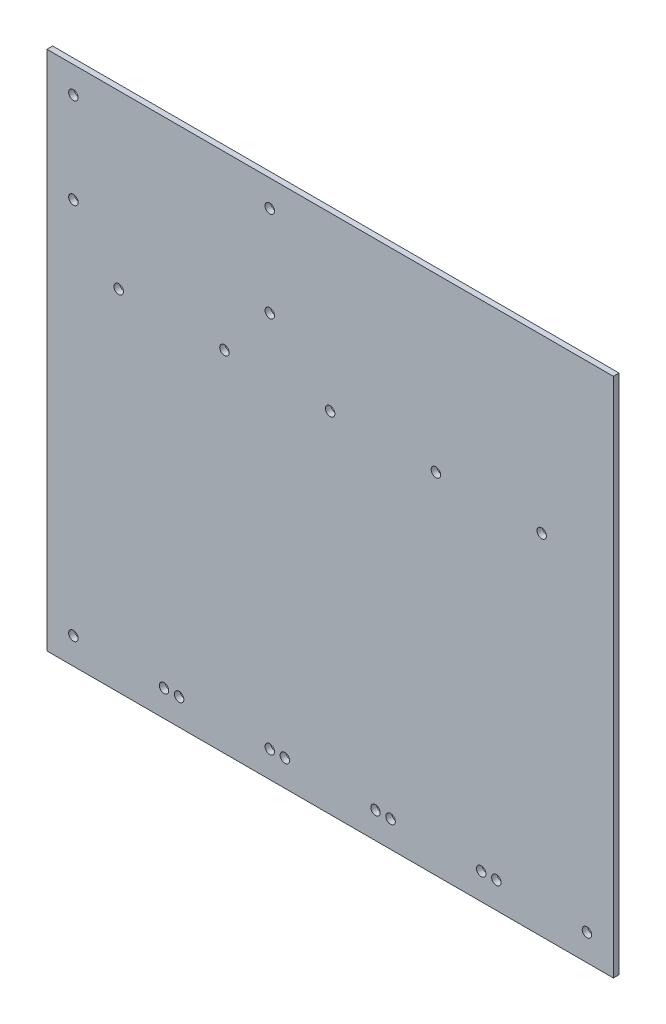
ISO-10303-21;
HEADER;
FILE_DESCRIPTION(('STEP AP214'),'2;1');
FILE_NAME('part.step','',(''),(''),'','','');
FILE_SCHEMA(('AUTOMOTIVE_DESIGN { 1 0 10303 214 1 1 1 1 }'));
ENDSEC;
DATA;
#1=APPLICATION_CONTEXT('core data for automotive mechanical design processes');
#2=APPLICATION_PROTOCOL_DEFINITION('international standard','automotive_design',2000,#1);
#3=PRODUCT_CONTEXT('',#1,'mechanical');
#4=PRODUCT('Part','Part','',(#3));
#5=PRODUCT_RELATED_PRODUCT_CATEGORY('part','',(#4));
#6=PRODUCT_DEFINITION_FORMATION('','',#4);
#7=PRODUCT_DEFINITION_CONTEXT('part definition',#1,'design');
#8=PRODUCT_DEFINITION('design','',#6,#7);
#9=PRODUCT_DEFINITION_SHAPE('','',#8);
#10=(LENGTH_UNIT() NAMED_UNIT(*) SI_UNIT(.MILLI.,.METRE.));
#11=(NAMED_UNIT(*) PLANE_ANGLE_UNIT() SI_UNIT($,.RADIAN.));
#12=(NAMED_UNIT(*) SI_UNIT($,.STERADIAN.) SOLID_ANGLE_UNIT());
#13=UNCERTAINTY_MEASURE_WITH_UNIT(LENGTH_MEASURE(1.E-05),#10,'distance_accuracy_value','');
#14=(GEOMETRIC_REPRESENTATION_CONTEXT(3) GLOBAL_UNCERTAINTY_ASSIGNED_CONTEXT((#13)) GLOBAL_UNIT_ASSIGNED_CONTEXT((#10,
#11,#12)) REPRESENTATION_CONTEXT('',''));
#15=CARTESIAN_POINT('',(0.,0.,0.));
#16=DIRECTION('',(0.,0.,1.));
#17=DIRECTION('',(1.,0.,0.));
#18=AXIS2_PLACEMENT_3D('',#15,#16,#17);
#19=CARTESIAN_POINT('',(0.,0.,3.));
#20=DIRECTION('',(0.,0.,1.));
#21=DIRECTION('',(1.,0.,0.));
#22=AXIS2_PLACEMENT_3D('',#19,#20,#21);
#23=PLANE('',#22);
#24=CARTESIAN_POINT('',(-28.,175.,3.));
#25=DIRECTION('',(0.,0.,1.));
#26=DIRECTION('',(1.,0.,0.));
#27=AXIS2_PLACEMENT_3D('',#24,#25,#26);
#28=CIRCLE('',#27,2.50000000000001);
#29=CARTESIAN_POINT('',(-25.5,175.,3.));
#30=VERTEX_POINT('',#29);
#31=EDGE_CURVE('E125',#30,#30,#28,.T.);
#32=ORIENTED_EDGE('',*,*,#31,.F.);
#33=EDGE_LOOP('',(#32));
#34=FACE_BOUND('',#33,.T.);
#35=CARTESIAN_POINT('',(84.,175.,3.));
#36=DIRECTION('',(0.,0.,1.));
#37=DIRECTION('',(1.,0.,0.));
#38=AXIS2_PLACEMENT_3D('',#35,#36,#37);
#39=CIRCLE('',#38,2.50000000000001);
#40=CARTESIAN_POINT('',(86.5,175.,3.));
#41=VERTEX_POINT('',#40);
#42=EDGE_CURVE('E137',#41,#41,#39,.T.);
#43=ORIENTED_EDGE('',*,*,#42,.F.);
#44=EDGE_LOOP('',(#43));
#45=FACE_BOUND('',#44,.T.);
#46=CARTESIAN_POINT('',(164.,4.,3.));
#47=DIRECTION('',(0.,0.,1.));
#48=DIRECTION('',(1.,0.,0.));
#49=AXIS2_PLACEMENT_3D('',#46,#47,#48);
#50=CIRCLE('',#49,2.5);
#51=CARTESIAN_POINT('',(166.5,4.,3.));
#52=VERTEX_POINT('',#51);
#53=EDGE_CURVE('E149',#52,#52,#50,.T.);
#54=ORIENTED_EDGE('',*,*,#53,.F.);
#55=EDGE_LOOP('',(#54));
#56=FACE_BOUND('',#55,.T.);
#57=CARTESIAN_POINT('',(108.,4.,3.));
#58=DIRECTION('',(0.,0.,1.));
#59=DIRECTION('',(1.,0.,0.));
#60=AXIS2_PLACEMENT_3D('',#57,#58,#59);
#61=CIRCLE('',#60,2.50000000000001);
#62=CARTESIAN_POINT('',(110.5,4.,3.));
#63=VERTEX_POINT('',#62);
#64=EDGE_CURVE('E161',#63,#63,#61,.T.);
#65=ORIENTED_EDGE('',*,*,#64,.F.);
#66=EDGE_LOOP('',(#65));
#67=FACE_BOUND('',#66,.T.);
#68=CARTESIAN_POINT('',(52.,3.99999999999997,3.));
#69=DIRECTION('',(0.,0.,1.));
#70=DIRECTION('',(1.,0.,0.));
#71=AXIS2_PLACEMENT_3D('',#68,#69,#70);
#72=CIRCLE('',#71,2.5);
#73=CARTESIAN_POINT('',(54.5,3.99999999999997,3.));
#74=VERTEX_POINT('',#73);
#75=EDGE_CURVE('E173',#74,#74,#72,.T.);
#76=ORIENTED_EDGE('',*,*,#75,.F.);
#77=EDGE_LOOP('',(#76));
#78=FACE_BOUND('',#77,.T.);
#79=CARTESIAN_POINT('',(-4.,4.,3.));
#80=DIRECTION('',(0.,0.,1.));
#81=DIRECTION('',(1.,0.,0.));
#82=AXIS2_PLACEMENT_3D('',#79,#80,#81);
#83=CIRCLE('',#82,2.5);
#84=CARTESIAN_POINT('',(-1.5,4.,3.));
#85=VERTEX_POINT('',#84);
#86=EDGE_CURVE('E185',#85,#85,#83,.T.);
#87=ORIENTED_EDGE('',*,*,#86,.F.);
#88=EDGE_LOOP('',(#87));
#89=FACE_BOUND('',#88,.T.);
#90=CARTESIAN_POINT('',(-60.,4.,3.));
#91=DIRECTION('',(0.,0.,1.));
#92=DIRECTION('',(1.,0.,0.));
#93=AXIS2_PLACEMENT_3D('',#90,#91,#92);
#94=CIRCLE('',#93,2.5);
#95=CARTESIAN_POINT('',(-57.5,4.,3.));
#96=VERTEX_POINT('',#95);
#97=EDGE_CURVE('E197',#96,#96,#94,.T.);
#98=ORIENTED_EDGE('',*,*,#97,.F.);
#99=EDGE_LOOP('',(#98));
#100=FACE_BOUND('',#99,.T.);
#101=DIRECTION('',(0.,-1.,0.));
#102=VECTOR('',#101,1.);
#103=CARTESIAN_POINT('',(178.,0.,3.));
#104=LINE('',#103,#102);
#105=CARTESIAN_POINT('',(178.,266.,3.));
#106=VERTEX_POINT('',#105);
#107=CARTESIAN_POINT('',(178.,-9.99999999999999,3.));
#108=VERTEX_POINT('',#107);
#109=EDGE_CURVE('E96',#106,#108,#104,.T.);
#110=ORIENTED_EDGE('',*,*,#109,.F.);
#111=DIRECTION('',(-1.,0.,0.));
#112=VECTOR('',#111,1.);
#113=CARTESIAN_POINT('',(178.,266.,3.));
#114=LINE('',#113,#112);
#115=CARTESIAN_POINT('',(-122.,266.,3.));
#116=VERTEX_POINT('',#115);
#117=EDGE_CURVE('E90',#106,#116,#114,.T.);
#118=ORIENTED_EDGE('',*,*,#117,.T.);
#119=DIRECTION('',(0.,-1.,0.));
#120=VECTOR('',#119,1.);
#121=CARTESIAN_POINT('',(-122.,0.,3.));
#122=LINE('',#121,#120);
#123=CARTESIAN_POINT('',(-122.,-9.99999999999999,3.));
#124=VERTEX_POINT('',#123);
#125=EDGE_CURVE('E64',#116,#124,#122,.T.);
#126=ORIENTED_EDGE('',*,*,#125,.T.);
#127=DIRECTION('',(1.,0.,0.));
#128=VECTOR('',#127,1.);
#129=CARTESIAN_POINT('',(-122.,-9.99999999999999,3.));
#130=LINE('',#129,#128);
#131=EDGE_CURVE('E92',#124,#108,#130,.T.);
#132=ORIENTED_EDGE('',*,*,#131,.T.);
#133=EDGE_LOOP('',(#110,#118,#126,#132));
#134=FACE_BOUND('',#133,.T.);
#135=CARTESIAN_POINT('',(-108.,4.,3.));
#136=DIRECTION('',(0.,0.,1.));
#137=DIRECTION('',(1.,0.,0.));
#138=AXIS2_PLACEMENT_3D('',#135,#136,#137);
#139=CIRCLE('',#138,2.50000000000001);
#140=CARTESIAN_POINT('',(-105.5,4.,3.));
#141=VERTEX_POINT('',#140);
#142=EDGE_CURVE('E11',#141,#141,#139,.T.);
#143=ORIENTED_EDGE('',*,*,#142,.F.);
#144=EDGE_LOOP('',(#143));
#145=FACE_BOUND('',#144,.T.);
#146=CARTESIAN_POINT('',(-52.,4.,3.));
#147=DIRECTION('',(0.,0.,1.));
#148=DIRECTION('',(1.,0.,0.));
#149=AXIS2_PLACEMENT_3D('',#146,#147,#148);
#150=CIRCLE('',#149,2.50000000000001);
#151=CARTESIAN_POINT('',(-49.5,4.,3.));
#152=VERTEX_POINT('',#151);
#153=EDGE_CURVE('E191',#152,#152,#150,.T.);
#154=ORIENTED_EDGE('',*,*,#153,.F.);
#155=EDGE_LOOP('',(#154));
#156=FACE_BOUND('',#155,.T.);
#157=CARTESIAN_POINT('',(4.,3.99999999999997,3.));
#158=DIRECTION('',(0.,0.,1.));
#159=DIRECTION('',(1.,0.,0.));
#160=AXIS2_PLACEMENT_3D('',#157,#158,#159);
#161=CIRCLE('',#160,2.50000000000001);
#162=CARTESIAN_POINT('',(6.50000000000001,3.99999999999997,3.));
#163=VERTEX_POINT('',#162);
#164=EDGE_CURVE('E179',#163,#163,#161,.T.);
#165=ORIENTED_EDGE('',*,*,#164,.F.);
#166=EDGE_LOOP('',(#165));
#167=FACE_BOUND('',#166,.T.);
#168=CARTESIAN_POINT('',(60.,4.,3.));
#169=DIRECTION('',(0.,0.,1.));
#170=DIRECTION('',(1.,0.,0.));
#171=AXIS2_PLACEMENT_3D('',#168,#169,#170);
#172=CIRCLE('',#171,2.50000000000002);
#173=CARTESIAN_POINT('',(62.5,4.,3.));
#174=VERTEX_POINT('',#173);
#175=EDGE_CURVE('E167',#174,#174,#172,.T.);
#176=ORIENTED_EDGE('',*,*,#175,.F.);
#177=EDGE_LOOP('',(#176));
#178=FACE_BOUND('',#177,.T.);
#179=CARTESIAN_POINT('',(116.,4.,3.));
#180=DIRECTION('',(0.,0.,1.));
#181=DIRECTION('',(1.,0.,0.));
#182=AXIS2_PLACEMENT_3D('',#179,#180,#181);
#183=CIRCLE('',#182,2.50000000000001);
#184=CARTESIAN_POINT('',(118.5,4.,3.));
#185=VERTEX_POINT('',#184);
#186=EDGE_CURVE('E155',#185,#185,#183,.T.);
#187=ORIENTED_EDGE('',*,*,#186,.F.);
#188=EDGE_LOOP('',(#187));
#189=FACE_BOUND('',#188,.T.);
#190=CARTESIAN_POINT('',(140.,175.,3.));
#191=DIRECTION('',(0.,0.,1.));
#192=DIRECTION('',(1.,0.,0.));
#193=AXIS2_PLACEMENT_3D('',#190,#191,#192);
#194=CIRCLE('',#193,2.5);
#195=CARTESIAN_POINT('',(142.5,175.,3.));
#196=VERTEX_POINT('',#195);
#197=EDGE_CURVE('E143',#196,#196,#194,.T.);
#198=ORIENTED_EDGE('',*,*,#197,.F.);
#199=EDGE_LOOP('',(#198));
#200=FACE_BOUND('',#199,.T.);
#201=CARTESIAN_POINT('',(28.,175.,3.));
#202=DIRECTION('',(0.,0.,1.));
#203=DIRECTION('',(1.,0.,0.));
#204=AXIS2_PLACEMENT_3D('',#201,#202,#203);
#205=CIRCLE('',#204,2.49999999999999);
#206=CARTESIAN_POINT('',(30.5,175.,3.));
#207=VERTEX_POINT('',#206);
#208=EDGE_CURVE('E131',#207,#207,#205,.T.);
#209=ORIENTED_EDGE('',*,*,#208,.F.);
#210=EDGE_LOOP('',(#209));
#211=FACE_BOUND('',#210,.T.);
#212=CARTESIAN_POINT('',(-84.,175.,3.));
#213=DIRECTION('',(0.,0.,1.));
#214=DIRECTION('',(1.,0.,0.));
#215=AXIS2_PLACEMENT_3D('',#212,#213,#214);
#216=CIRCLE('',#215,2.5);
#217=CARTESIAN_POINT('',(-81.5,175.,3.));
#218=VERTEX_POINT('',#217);
#219=EDGE_CURVE('E119',#218,#218,#216,.T.);
#220=ORIENTED_EDGE('',*,*,#219,.F.);
#221=EDGE_LOOP('',(#220));
#222=FACE_BOUND('',#221,.T.);
#223=CARTESIAN_POINT('',(-108.,204.,3.));
#224=DIRECTION('',(0.,0.,1.));
#225=DIRECTION('',(1.,0.,0.));
#226=AXIS2_PLACEMENT_3D('',#223,#224,#225);
#227=CIRCLE('',#226,2.5);
#228=CARTESIAN_POINT('',(-105.5,204.,3.));
#229=VERTEX_POINT('',#228);
#230=EDGE_CURVE('E299',#229,#229,#227,.T.);
#231=ORIENTED_EDGE('',*,*,#230,.F.);
#232=EDGE_LOOP('',(#231));
#233=FACE_BOUND('',#232,.T.);
#234=CARTESIAN_POINT('',(-108.,252.,3.));
#235=DIRECTION('',(0.,0.,1.));
#236=DIRECTION('',(1.,0.,0.));
#237=AXIS2_PLACEMENT_3D('',#234,#235,#236);
#238=CIRCLE('',#237,2.5);
#239=CARTESIAN_POINT('',(-105.5,252.,3.));
#240=VERTEX_POINT('',#239);
#241=EDGE_CURVE('E295',#240,#240,#238,.T.);
#242=ORIENTED_EDGE('',*,*,#241,.F.);
#243=EDGE_LOOP('',(#242));
#244=FACE_BOUND('',#243,.T.);
#245=CARTESIAN_POINT('',(-4.00000000000027,252.,3.));
#246=DIRECTION('',(0.,0.,1.));
#247=DIRECTION('',(1.,0.,0.));
#248=AXIS2_PLACEMENT_3D('',#245,#246,#247);
#249=CIRCLE('',#248,2.49999999999999);
#250=CARTESIAN_POINT('',(-1.50000000000028,252.,3.));
#251=VERTEX_POINT('',#250);
#252=EDGE_CURVE('E290',#251,#251,#249,.T.);
#253=ORIENTED_EDGE('',*,*,#252,.F.);
#254=EDGE_LOOP('',(#253));
#255=FACE_BOUND('',#254,.T.);
#256=CARTESIAN_POINT('',(-4.00000000000027,204.,3.));
#257=DIRECTION('',(0.,0.,1.));
#258=DIRECTION('',(1.,0.,0.));
#259=AXIS2_PLACEMENT_3D('',#256,#257,#258);
#260=CIRCLE('',#259,2.5);
#261=CARTESIAN_POINT('',(-1.50000000000027,204.,3.));
#262=VERTEX_POINT('',#261);
#263=EDGE_CURVE('E102',#262,#262,#260,.T.);
#264=ORIENTED_EDGE('',*,*,#263,.F.);
#265=EDGE_LOOP('',(#264));
#266=FACE_BOUND('',#265,.T.);
#267=ADVANCED_FACE('F35',(#34,#45,#56,#67,#78,#89,#100,#134,#145,#156,#167,#178,#189,#200,#211,
#222,#233,#244,#255,#266),#23,.T.);
#268=CARTESIAN_POINT('',(0.,0.,0.));
#269=DIRECTION('',(0.,0.,1.));
#270=DIRECTION('',(1.,0.,0.));
#271=AXIS2_PLACEMENT_3D('',#268,#269,#270);
#272=PLANE('',#271);
#273=DIRECTION('',(0.,-1.,0.));
#274=VECTOR('',#273,1.);
#275=CARTESIAN_POINT('',(178.,0.,0.));
#276=LINE('',#275,#274);
#277=CARTESIAN_POINT('',(178.,266.,0.));
#278=VERTEX_POINT('',#277);
#279=CARTESIAN_POINT('',(178.,-9.99999999999999,0.));
#280=VERTEX_POINT('',#279);
#281=EDGE_CURVE('E52',#278,#280,#276,.T.);
#282=ORIENTED_EDGE('',*,*,#281,.T.);
#283=DIRECTION('',(1.,0.,0.));
#284=VECTOR('',#283,1.);
#285=CARTESIAN_POINT('',(-122.,-9.99999999999999,0.));
#286=LINE('',#285,#284);
#287=CARTESIAN_POINT('',(-122.,-9.99999999999999,0.));
#288=VERTEX_POINT('',#287);
#289=EDGE_CURVE('E107',#288,#280,#286,.T.);
#290=ORIENTED_EDGE('',*,*,#289,.F.);
#291=DIRECTION('',(0.,-1.,0.));
#292=VECTOR('',#291,1.);
#293=CARTESIAN_POINT('',(-122.,0.,0.));
#294=LINE('',#293,#292);
#295=CARTESIAN_POINT('',(-122.,266.,0.));
#296=VERTEX_POINT('',#295);
#297=EDGE_CURVE('E70',#296,#288,#294,.T.);
#298=ORIENTED_EDGE('',*,*,#297,.F.);
#299=DIRECTION('',(-1.,0.,0.));
#300=VECTOR('',#299,1.);
#301=CARTESIAN_POINT('',(178.,266.,0.));
#302=LINE('',#301,#300);
#303=EDGE_CURVE('E91',#278,#296,#302,.T.);
#304=ORIENTED_EDGE('',*,*,#303,.F.);
#305=EDGE_LOOP('',(#282,#290,#298,#304));
#306=FACE_BOUND('',#305,.T.);
#307=CARTESIAN_POINT('',(-108.,4.,0.));
#308=DIRECTION('',(0.,0.,1.));
#309=DIRECTION('',(1.,0.,0.));
#310=AXIS2_PLACEMENT_3D('',#307,#308,#309);
#311=CIRCLE('',#310,2.50000000000001);
#312=CARTESIAN_POINT('',(-105.5,4.,0.));
#313=VERTEX_POINT('',#312);
#314=EDGE_CURVE('E39',#313,#313,#311,.T.);
#315=ORIENTED_EDGE('',*,*,#314,.T.);
#316=EDGE_LOOP('',(#315));
#317=FACE_BOUND('',#316,.T.);
#318=CARTESIAN_POINT('',(-60.,4.,0.));
#319=DIRECTION('',(0.,0.,1.));
#320=DIRECTION('',(1.,0.,0.));
#321=AXIS2_PLACEMENT_3D('',#318,#319,#320);
#322=CIRCLE('',#321,2.5);
#323=CARTESIAN_POINT('',(-57.5,4.,0.));
#324=VERTEX_POINT('',#323);
#325=EDGE_CURVE('E194',#324,#324,#322,.T.);
#326=ORIENTED_EDGE('',*,*,#325,.T.);
#327=EDGE_LOOP('',(#326));
#328=FACE_BOUND('',#327,.T.);
#329=CARTESIAN_POINT('',(-52.,4.,0.));
#330=DIRECTION('',(0.,0.,1.));
#331=DIRECTION('',(1.,0.,0.));
#332=AXIS2_PLACEMENT_3D('',#329,#330,#331);
#333=CIRCLE('',#332,2.50000000000001);
#334=CARTESIAN_POINT('',(-49.5,4.,0.));
#335=VERTEX_POINT('',#334);
#336=EDGE_CURVE('E188',#335,#335,#333,.T.);
#337=ORIENTED_EDGE('',*,*,#336,.T.);
#338=EDGE_LOOP('',(#337));
#339=FACE_BOUND('',#338,.T.);
#340=CARTESIAN_POINT('',(-4.,4.,0.));
#341=DIRECTION('',(0.,0.,1.));
#342=DIRECTION('',(1.,0.,0.));
#343=AXIS2_PLACEMENT_3D('',#340,#341,#342);
#344=CIRCLE('',#343,2.5);
#345=CARTESIAN_POINT('',(-1.5,4.,0.));
#346=VERTEX_POINT('',#345);
#347=EDGE_CURVE('E182',#346,#346,#344,.T.);
#348=ORIENTED_EDGE('',*,*,#347,.T.);
#349=EDGE_LOOP('',(#348));
#350=FACE_BOUND('',#349,.T.);
#351=CARTESIAN_POINT('',(4.,3.99999999999997,0.));
#352=DIRECTION('',(0.,0.,1.));
#353=DIRECTION('',(1.,0.,0.));
#354=AXIS2_PLACEMENT_3D('',#351,#352,#353);
#355=CIRCLE('',#354,2.50000000000001);
#356=CARTESIAN_POINT('',(6.50000000000001,3.99999999999997,0.));
#357=VERTEX_POINT('',#356);
#358=EDGE_CURVE('E176',#357,#357,#355,.T.);
#359=ORIENTED_EDGE('',*,*,#358,.T.);
#360=EDGE_LOOP('',(#359));
#361=FACE_BOUND('',#360,.T.);
#362=CARTESIAN_POINT('',(52.,3.99999999999997,0.));
#363=DIRECTION('',(0.,0.,1.));
#364=DIRECTION('',(1.,0.,0.));
#365=AXIS2_PLACEMENT_3D('',#362,#363,#364);
#366=CIRCLE('',#365,2.5);
#367=CARTESIAN_POINT('',(54.5,3.99999999999997,0.));
#368=VERTEX_POINT('',#367);
#369=EDGE_CURVE('E170',#368,#368,#366,.T.);
#370=ORIENTED_EDGE('',*,*,#369,.T.);
#371=EDGE_LOOP('',(#370));
#372=FACE_BOUND('',#371,.T.);
#373=CARTESIAN_POINT('',(60.,4.,0.));
#374=DIRECTION('',(0.,0.,1.));
#375=DIRECTION('',(1.,0.,0.));
#376=AXIS2_PLACEMENT_3D('',#373,#374,#375);
#377=CIRCLE('',#376,2.50000000000002);
#378=CARTESIAN_POINT('',(62.5,4.,0.));
#379=VERTEX_POINT('',#378);
#380=EDGE_CURVE('E164',#379,#379,#377,.T.);
#381=ORIENTED_EDGE('',*,*,#380,.T.);
#382=EDGE_LOOP('',(#381));
#383=FACE_BOUND('',#382,.T.);
#384=CARTESIAN_POINT('',(108.,4.,0.));
#385=DIRECTION('',(0.,0.,1.));
#386=DIRECTION('',(1.,0.,0.));
#387=AXIS2_PLACEMENT_3D('',#384,#385,#386);
#388=CIRCLE('',#387,2.50000000000001);
#389=CARTESIAN_POINT('',(110.5,4.,0.));
#390=VERTEX_POINT('',#389);
#391=EDGE_CURVE('E158',#390,#390,#388,.T.);
#392=ORIENTED_EDGE('',*,*,#391,.T.);
#393=EDGE_LOOP('',(#392));
#394=FACE_BOUND('',#393,.T.);
#395=CARTESIAN_POINT('',(116.,4.,0.));
#396=DIRECTION('',(0.,0.,1.));
#397=DIRECTION('',(1.,0.,0.));
#398=AXIS2_PLACEMENT_3D('',#395,#396,#397);
#399=CIRCLE('',#398,2.50000000000001);
#400=CARTESIAN_POINT('',(118.5,4.,0.));
#401=VERTEX_POINT('',#400);
#402=EDGE_CURVE('E152',#401,#401,#399,.T.);
#403=ORIENTED_EDGE('',*,*,#402,.T.);
#404=EDGE_LOOP('',(#403));
#405=FACE_BOUND('',#404,.T.);
#406=CARTESIAN_POINT('',(164.,4.,0.));
#407=DIRECTION('',(0.,0.,1.));
#408=DIRECTION('',(1.,0.,0.));
#409=AXIS2_PLACEMENT_3D('',#406,#407,#408);
#410=CIRCLE('',#409,2.5);
#411=CARTESIAN_POINT('',(166.5,4.,0.));
#412=VERTEX_POINT('',#411);
#413=EDGE_CURVE('E146',#412,#412,#410,.T.);
#414=ORIENTED_EDGE('',*,*,#413,.T.);
#415=EDGE_LOOP('',(#414));
#416=FACE_BOUND('',#415,.T.);
#417=CARTESIAN_POINT('',(140.,175.,0.));
#418=DIRECTION('',(0.,0.,1.));
#419=DIRECTION('',(1.,0.,0.));
#420=AXIS2_PLACEMENT_3D('',#417,#418,#419);
#421=CIRCLE('',#420,2.5);
#422=CARTESIAN_POINT('',(142.5,175.,0.));
#423=VERTEX_POINT('',#422);
#424=EDGE_CURVE('E140',#423,#423,#421,.T.);
#425=ORIENTED_EDGE('',*,*,#424,.T.);
#426=EDGE_LOOP('',(#425));
#427=FACE_BOUND('',#426,.T.);
#428=CARTESIAN_POINT('',(84.,175.,0.));
#429=DIRECTION('',(0.,0.,1.));
#430=DIRECTION('',(1.,0.,0.));
#431=AXIS2_PLACEMENT_3D('',#428,#429,#430);
#432=CIRCLE('',#431,2.50000000000001);
#433=CARTESIAN_POINT('',(86.5,175.,0.));
#434=VERTEX_POINT('',#433);
#435=EDGE_CURVE('E134',#434,#434,#432,.T.);
#436=ORIENTED_EDGE('',*,*,#435,.T.);
#437=EDGE_LOOP('',(#436));
#438=FACE_BOUND('',#437,.T.);
#439=CARTESIAN_POINT('',(28.,175.,0.));
#440=DIRECTION('',(0.,0.,1.));
#441=DIRECTION('',(1.,0.,0.));
#442=AXIS2_PLACEMENT_3D('',#439,#440,#441);
#443=CIRCLE('',#442,2.49999999999999);
#444=CARTESIAN_POINT('',(30.5,175.,0.));
#445=VERTEX_POINT('',#444);
#446=EDGE_CURVE('E128',#445,#445,#443,.T.);
#447=ORIENTED_EDGE('',*,*,#446,.T.);
#448=EDGE_LOOP('',(#447));
#449=FACE_BOUND('',#448,.T.);
#450=CARTESIAN_POINT('',(-28.,175.,0.));
#451=DIRECTION('',(0.,0.,1.));
#452=DIRECTION('',(1.,0.,0.));
#453=AXIS2_PLACEMENT_3D('',#450,#451,#452);
#454=CIRCLE('',#453,2.50000000000001);
#455=CARTESIAN_POINT('',(-25.5,175.,0.));
#456=VERTEX_POINT('',#455);
#457=EDGE_CURVE('E122',#456,#456,#454,.T.);
#458=ORIENTED_EDGE('',*,*,#457,.T.);
#459=EDGE_LOOP('',(#458));
#460=FACE_BOUND('',#459,.T.);
#461=CARTESIAN_POINT('',(-84.,175.,0.));
#462=DIRECTION('',(0.,0.,1.));
#463=DIRECTION('',(1.,0.,0.));
#464=AXIS2_PLACEMENT_3D('',#461,#462,#463);
#465=CIRCLE('',#464,2.5);
#466=CARTESIAN_POINT('',(-81.5,175.,0.));
#467=VERTEX_POINT('',#466);
#468=EDGE_CURVE('E117',#467,#467,#465,.T.);
#469=ORIENTED_EDGE('',*,*,#468,.T.);
#470=EDGE_LOOP('',(#469));
#471=FACE_BOUND('',#470,.T.);
#472=CARTESIAN_POINT('',(-108.,204.,0.));
#473=DIRECTION('',(0.,0.,1.));
#474=DIRECTION('',(1.,0.,0.));
#475=AXIS2_PLACEMENT_3D('',#472,#473,#474);
#476=CIRCLE('',#475,2.5);
#477=CARTESIAN_POINT('',(-105.5,204.,0.));
#478=VERTEX_POINT('',#477);
#479=EDGE_CURVE('E271',#478,#478,#476,.T.);
#480=ORIENTED_EDGE('',*,*,#479,.T.);
#481=EDGE_LOOP('',(#480));
#482=FACE_BOUND('',#481,.T.);
#483=CARTESIAN_POINT('',(-108.,252.,0.));
#484=DIRECTION('',(0.,0.,1.));
#485=DIRECTION('',(1.,0.,0.));
#486=AXIS2_PLACEMENT_3D('',#483,#484,#485);
#487=CIRCLE('',#486,2.5);
#488=CARTESIAN_POINT('',(-105.5,252.,0.));
#489=VERTEX_POINT('',#488);
#490=EDGE_CURVE('E275',#489,#489,#487,.T.);
#491=ORIENTED_EDGE('',*,*,#490,.T.);
#492=EDGE_LOOP('',(#491));
#493=FACE_BOUND('',#492,.T.);
#494=CARTESIAN_POINT('',(-4.00000000000027,252.,0.));
#495=DIRECTION('',(0.,0.,1.));
#496=DIRECTION('',(1.,0.,0.));
#497=AXIS2_PLACEMENT_3D('',#494,#495,#496);
#498=CIRCLE('',#497,2.49999999999999);
#499=CARTESIAN_POINT('',(-1.50000000000028,252.,0.));
#500=VERTEX_POINT('',#499);
#501=EDGE_CURVE('E279',#500,#500,#498,.T.);
#502=ORIENTED_EDGE('',*,*,#501,.T.);
#503=EDGE_LOOP('',(#502));
#504=FACE_BOUND('',#503,.T.);
#505=CARTESIAN_POINT('',(-4.00000000000027,204.,0.));
#506=DIRECTION('',(0.,0.,1.));
#507=DIRECTION('',(1.,0.,0.));
#508=AXIS2_PLACEMENT_3D('',#505,#506,#507);
#509=CIRCLE('',#508,2.5);
#510=CARTESIAN_POINT('',(-1.50000000000027,204.,0.));
#511=VERTEX_POINT('',#510);
#512=EDGE_CURVE('E98',#511,#511,#509,.T.);
#513=ORIENTED_EDGE('',*,*,#512,.T.);
#514=EDGE_LOOP('',(#513));
#515=FACE_BOUND('',#514,.T.);
#516=ADVANCED_FACE('F37',(#306,#317,#328,#339,#350,#361,#372,#383,#394,#405,#416,#427,#438,#449,
#460,#471,#482,#493,#504,#515),#272,.F.);
#517=CARTESIAN_POINT('',(-108.,4.,3.));
#518=DIRECTION('',(0.,0.,-1.));
#519=DIRECTION('',(-1.,0.,0.));
#520=AXIS2_PLACEMENT_3D('',#517,#518,#519);
#521=CYLINDRICAL_SURFACE('',#520,2.50000000000001);
#522=ORIENTED_EDGE('',*,*,#142,.T.);
#523=EDGE_LOOP('',(#522));
#524=FACE_BOUND('',#523,.T.);
#525=ORIENTED_EDGE('',*,*,#314,.F.);
#526=EDGE_LOOP('',(#525));
#527=FACE_BOUND('',#526,.T.);
#528=ADVANCED_FACE('F208',(#524,#527),#521,.F.);
#529=CARTESIAN_POINT('',(-60.,4.,3.));
#530=DIRECTION('',(0.,0.,-1.));
#531=DIRECTION('',(-1.,0.,0.));
#532=AXIS2_PLACEMENT_3D('',#529,#530,#531);
#533=CYLINDRICAL_SURFACE('',#532,2.5);
#534=ORIENTED_EDGE('',*,*,#97,.T.);
#535=EDGE_LOOP('',(#534));
#536=FACE_BOUND('',#535,.T.);
#537=ORIENTED_EDGE('',*,*,#325,.F.);
#538=EDGE_LOOP('',(#537));
#539=FACE_BOUND('',#538,.T.);
#540=ADVANCED_FACE('F205',(#536,#539),#533,.F.);
#541=CARTESIAN_POINT('',(-52.,4.,3.));
#542=DIRECTION('',(0.,0.,-1.));
#543=DIRECTION('',(-1.,0.,0.));
#544=AXIS2_PLACEMENT_3D('',#541,#542,#543);
#545=CYLINDRICAL_SURFACE('',#544,2.50000000000001);
#546=ORIENTED_EDGE('',*,*,#153,.T.);
#547=EDGE_LOOP('',(#546));
#548=FACE_BOUND('',#547,.T.);
#549=ORIENTED_EDGE('',*,*,#336,.F.);
#550=EDGE_LOOP('',(#549));
#551=FACE_BOUND('',#550,.T.);
#552=ADVANCED_FACE('F207',(#548,#551),#545,.F.);
#553=CARTESIAN_POINT('',(-4.,4.,3.));
#554=DIRECTION('',(0.,0.,-1.));
#555=DIRECTION('',(-1.,0.,0.));
#556=AXIS2_PLACEMENT_3D('',#553,#554,#555);
#557=CYLINDRICAL_SURFACE('',#556,2.5);
#558=ORIENTED_EDGE('',*,*,#86,.T.);
#559=EDGE_LOOP('',(#558));
#560=FACE_BOUND('',#559,.T.);
#561=ORIENTED_EDGE('',*,*,#347,.F.);
#562=EDGE_LOOP('',(#561));
#563=FACE_BOUND('',#562,.T.);
#564=ADVANCED_FACE('F215',(#560,#563),#557,.F.);
#565=CARTESIAN_POINT('',(4.,3.99999999999997,3.));
#566=DIRECTION('',(0.,0.,-1.));
#567=DIRECTION('',(-1.,0.,0.));
#568=AXIS2_PLACEMENT_3D('',#565,#566,#567);
#569=CYLINDRICAL_SURFACE('',#568,2.50000000000001);
#570=ORIENTED_EDGE('',*,*,#164,.T.);
#571=EDGE_LOOP('',(#570));
#572=FACE_BOUND('',#571,.T.);
#573=ORIENTED_EDGE('',*,*,#358,.F.);
#574=EDGE_LOOP('',(#573));
#575=FACE_BOUND('',#574,.T.);
#576=ADVANCED_FACE('F241',(#572,#575),#569,.F.);
#577=CARTESIAN_POINT('',(52.,3.99999999999997,3.));
#578=DIRECTION('',(0.,0.,-1.));
#579=DIRECTION('',(-1.,0.,0.));
#580=AXIS2_PLACEMENT_3D('',#577,#578,#579);
#581=CYLINDRICAL_SURFACE('',#580,2.5);
#582=ORIENTED_EDGE('',*,*,#75,.T.);
#583=EDGE_LOOP('',(#582));
#584=FACE_BOUND('',#583,.T.);
#585=ORIENTED_EDGE('',*,*,#369,.F.);
#586=EDGE_LOOP('',(#585));
#587=FACE_BOUND('',#586,.T.);
#588=ADVANCED_FACE('F369',(#584,#587),#581,.F.);
#589=CARTESIAN_POINT('',(60.,4.,3.));
#590=DIRECTION('',(0.,0.,-1.));
#591=DIRECTION('',(-1.,0.,0.));
#592=AXIS2_PLACEMENT_3D('',#589,#590,#591);
#593=CYLINDRICAL_SURFACE('',#592,2.50000000000002);
#594=ORIENTED_EDGE('',*,*,#175,.T.);
#595=EDGE_LOOP('',(#594));
#596=FACE_BOUND('',#595,.T.);
#597=ORIENTED_EDGE('',*,*,#380,.F.);
#598=EDGE_LOOP('',(#597));
#599=FACE_BOUND('',#598,.T.);
#600=ADVANCED_FACE('F365',(#596,#599),#593,.F.);
#601=CARTESIAN_POINT('',(108.,4.,3.));
#602=DIRECTION('',(0.,0.,-1.));
#603=DIRECTION('',(-1.,0.,0.));
#604=AXIS2_PLACEMENT_3D('',#601,#602,#603);
#605=CYLINDRICAL_SURFACE('',#604,2.50000000000001);
#606=ORIENTED_EDGE('',*,*,#64,.T.);
#607=EDGE_LOOP('',(#606));
#608=FACE_BOUND('',#607,.T.);
#609=ORIENTED_EDGE('',*,*,#391,.F.);
#610=EDGE_LOOP('',(#609));
#611=FACE_BOUND('',#610,.T.);
#612=ADVANCED_FACE('F361',(#608,#611),#605,.F.);
#613=CARTESIAN_POINT('',(116.,4.,3.));
#614=DIRECTION('',(0.,0.,-1.));
#615=DIRECTION('',(-1.,0.,0.));
#616=AXIS2_PLACEMENT_3D('',#613,#614,#615);
#617=CYLINDRICAL_SURFACE('',#616,2.50000000000001);
#618=ORIENTED_EDGE('',*,*,#186,.T.);
#619=EDGE_LOOP('',(#618));
#620=FACE_BOUND('',#619,.T.);
#621=ORIENTED_EDGE('',*,*,#402,.F.);
#622=EDGE_LOOP('',(#621));
#623=FACE_BOUND('',#622,.T.);
#624=ADVANCED_FACE('F357',(#620,#623),#617,.F.);
#625=CARTESIAN_POINT('',(164.,4.,3.));
#626=DIRECTION('',(0.,0.,-1.));
#627=DIRECTION('',(-1.,0.,0.));
#628=AXIS2_PLACEMENT_3D('',#625,#626,#627);
#629=CYLINDRICAL_SURFACE('',#628,2.5);
#630=ORIENTED_EDGE('',*,*,#53,.T.);
#631=EDGE_LOOP('',(#630));
#632=FACE_BOUND('',#631,.T.);
#633=ORIENTED_EDGE('',*,*,#413,.F.);
#634=EDGE_LOOP('',(#633));
#635=FACE_BOUND('',#634,.T.);
#636=ADVANCED_FACE('F353',(#632,#635),#629,.F.);
#637=CARTESIAN_POINT('',(140.,175.,3.));
#638=DIRECTION('',(0.,0.,-1.));
#639=DIRECTION('',(-1.,0.,0.));
#640=AXIS2_PLACEMENT_3D('',#637,#638,#639);
#641=CYLINDRICAL_SURFACE('',#640,2.5);
#642=ORIENTED_EDGE('',*,*,#197,.T.);
#643=EDGE_LOOP('',(#642));
#644=FACE_BOUND('',#643,.T.);
#645=ORIENTED_EDGE('',*,*,#424,.F.);
#646=EDGE_LOOP('',(#645));
#647=FACE_BOUND('',#646,.T.);
#648=ADVANCED_FACE('F349',(#644,#647),#641,.F.);
#649=CARTESIAN_POINT('',(84.,175.,3.));
#650=DIRECTION('',(0.,0.,-1.));
#651=DIRECTION('',(-1.,0.,0.));
#652=AXIS2_PLACEMENT_3D('',#649,#650,#651);
#653=CYLINDRICAL_SURFACE('',#652,2.50000000000001);
#654=ORIENTED_EDGE('',*,*,#42,.T.);
#655=EDGE_LOOP('',(#654));
#656=FACE_BOUND('',#655,.T.);
#657=ORIENTED_EDGE('',*,*,#435,.F.);
#658=EDGE_LOOP('',(#657));
#659=FACE_BOUND('',#658,.T.);
#660=ADVANCED_FACE('F345',(#656,#659),#653,.F.);
#661=CARTESIAN_POINT('',(28.,175.,3.));
#662=DIRECTION('',(0.,0.,-1.));
#663=DIRECTION('',(-1.,0.,0.));
#664=AXIS2_PLACEMENT_3D('',#661,#662,#663);
#665=CYLINDRICAL_SURFACE('',#664,2.49999999999999);
#666=ORIENTED_EDGE('',*,*,#208,.T.);
#667=EDGE_LOOP('',(#666));
#668=FACE_BOUND('',#667,.T.);
#669=ORIENTED_EDGE('',*,*,#446,.F.);
#670=EDGE_LOOP('',(#669));
#671=FACE_BOUND('',#670,.T.);
#672=ADVANCED_FACE('F341',(#668,#671),#665,.F.);
#673=CARTESIAN_POINT('',(-28.,175.,3.));
#674=DIRECTION('',(0.,0.,-1.));
#675=DIRECTION('',(-1.,0.,0.));
#676=AXIS2_PLACEMENT_3D('',#673,#674,#675);
#677=CYLINDRICAL_SURFACE('',#676,2.50000000000001);
#678=ORIENTED_EDGE('',*,*,#31,.T.);
#679=EDGE_LOOP('',(#678));
#680=FACE_BOUND('',#679,.T.);
#681=ORIENTED_EDGE('',*,*,#457,.F.);
#682=EDGE_LOOP('',(#681));
#683=FACE_BOUND('',#682,.T.);
#684=ADVANCED_FACE('F337',(#680,#683),#677,.F.);
#685=CARTESIAN_POINT('',(-84.,175.,3.));
#686=DIRECTION('',(0.,0.,-1.));
#687=DIRECTION('',(-1.,0.,0.));
#688=AXIS2_PLACEMENT_3D('',#685,#686,#687);
#689=CYLINDRICAL_SURFACE('',#688,2.5);
#690=ORIENTED_EDGE('',*,*,#219,.T.);
#691=EDGE_LOOP('',(#690));
#692=FACE_BOUND('',#691,.T.);
#693=ORIENTED_EDGE('',*,*,#468,.F.);
#694=EDGE_LOOP('',(#693));
#695=FACE_BOUND('',#694,.T.);
#696=ADVANCED_FACE('F334',(#692,#695),#689,.F.);
#697=CARTESIAN_POINT('',(-122.,0.,0.));
#698=DIRECTION('',(-1.,0.,0.));
#699=DIRECTION('',(0.,-1.,0.));
#700=AXIS2_PLACEMENT_3D('',#697,#698,#699);
#701=PLANE('',#700);
#702=ORIENTED_EDGE('',*,*,#125,.F.);
#703=DIRECTION('',(0.,0.,1.));
#704=VECTOR('',#703,1.);
#705=CARTESIAN_POINT('',(-122.,266.,0.));
#706=LINE('',#705,#704);
#707=EDGE_CURVE('E80',#296,#116,#706,.T.);
#708=ORIENTED_EDGE('',*,*,#707,.F.);
#709=ORIENTED_EDGE('',*,*,#297,.T.);
#710=DIRECTION('',(0.,0.,1.));
#711=VECTOR('',#710,1.);
#712=CARTESIAN_POINT('',(-122.,-9.99999999999999,0.));
#713=LINE('',#712,#711);
#714=EDGE_CURVE('E83',#288,#124,#713,.T.);
#715=ORIENTED_EDGE('',*,*,#714,.T.);
#716=EDGE_LOOP('',(#702,#708,#709,#715));
#717=FACE_BOUND('',#716,.T.);
#718=ADVANCED_FACE('F79',(#717),#701,.T.);
#719=CARTESIAN_POINT('',(178.,0.,0.));
#720=DIRECTION('',(-1.,0.,0.));
#721=DIRECTION('',(0.,0.,1.));
#722=AXIS2_PLACEMENT_3D('',#719,#720,#721);
#723=PLANE('',#722);
#724=ORIENTED_EDGE('',*,*,#109,.T.);
#725=DIRECTION('',(0.,0.,1.));
#726=VECTOR('',#725,1.);
#727=CARTESIAN_POINT('',(178.,-9.99999999999999,0.));
#728=LINE('',#727,#726);
#729=EDGE_CURVE('E111',#280,#108,#728,.T.);
#730=ORIENTED_EDGE('',*,*,#729,.F.);
#731=ORIENTED_EDGE('',*,*,#281,.F.);
#732=DIRECTION('',(0.,0.,1.));
#733=VECTOR('',#732,1.);
#734=CARTESIAN_POINT('',(178.,266.,0.));
#735=LINE('',#734,#733);
#736=EDGE_CURVE('E93',#278,#106,#735,.T.);
#737=ORIENTED_EDGE('',*,*,#736,.T.);
#738=EDGE_LOOP('',(#724,#730,#731,#737));
#739=FACE_BOUND('',#738,.T.);
#740=ADVANCED_FACE('F327',(#739),#723,.F.);
#741=CARTESIAN_POINT('',(-122.,-9.99999999999999,0.));
#742=DIRECTION('',(0.,-1.,0.));
#743=DIRECTION('',(0.,0.,-1.));
#744=AXIS2_PLACEMENT_3D('',#741,#742,#743);
#745=PLANE('',#744);
#746=ORIENTED_EDGE('',*,*,#131,.F.);
#747=ORIENTED_EDGE('',*,*,#714,.F.);
#748=ORIENTED_EDGE('',*,*,#289,.T.);
#749=ORIENTED_EDGE('',*,*,#729,.T.);
#750=EDGE_LOOP('',(#746,#747,#748,#749));
#751=FACE_BOUND('',#750,.T.);
#752=ADVANCED_FACE('F324',(#751),#745,.T.);
#753=CARTESIAN_POINT('',(178.,266.,0.));
#754=DIRECTION('',(0.,1.,0.));
#755=DIRECTION('',(0.,0.,1.));
#756=AXIS2_PLACEMENT_3D('',#753,#754,#755);
#757=PLANE('',#756);
#758=ORIENTED_EDGE('',*,*,#117,.F.);
#759=ORIENTED_EDGE('',*,*,#736,.F.);
#760=ORIENTED_EDGE('',*,*,#303,.T.);
#761=ORIENTED_EDGE('',*,*,#707,.T.);
#762=EDGE_LOOP('',(#758,#759,#760,#761));
#763=FACE_BOUND('',#762,.T.);
#764=ADVANCED_FACE('F88',(#763),#757,.T.);
#765=CARTESIAN_POINT('',(-4.00000000000027,204.,0.));
#766=DIRECTION('',(0.,0.,1.));
#767=DIRECTION('',(1.,0.,0.));
#768=AXIS2_PLACEMENT_3D('',#765,#766,#767);
#769=CYLINDRICAL_SURFACE('',#768,2.5);
#770=ORIENTED_EDGE('',*,*,#512,.F.);
#771=EDGE_LOOP('',(#770));
#772=FACE_BOUND('',#771,.T.);
#773=ORIENTED_EDGE('',*,*,#263,.T.);
#774=EDGE_LOOP('',(#773));
#775=FACE_BOUND('',#774,.T.);
#776=ADVANCED_FACE('F282',(#772,#775),#769,.F.);
#777=CARTESIAN_POINT('',(-4.00000000000027,252.,0.));
#778=DIRECTION('',(0.,0.,1.));
#779=DIRECTION('',(1.,0.,0.));
#780=AXIS2_PLACEMENT_3D('',#777,#778,#779);
#781=CYLINDRICAL_SURFACE('',#780,2.49999999999999);
#782=ORIENTED_EDGE('',*,*,#501,.F.);
#783=EDGE_LOOP('',(#782));
#784=FACE_BOUND('',#783,.T.);
#785=ORIENTED_EDGE('',*,*,#252,.T.);
#786=EDGE_LOOP('',(#785));
#787=FACE_BOUND('',#786,.T.);
#788=ADVANCED_FACE('F285',(#784,#787),#781,.F.);
#789=CARTESIAN_POINT('',(-108.,252.,0.));
#790=DIRECTION('',(0.,0.,1.));
#791=DIRECTION('',(1.,0.,0.));
#792=AXIS2_PLACEMENT_3D('',#789,#790,#791);
#793=CYLINDRICAL_SURFACE('',#792,2.5);
#794=ORIENTED_EDGE('',*,*,#490,.F.);
#795=EDGE_LOOP('',(#794));
#796=FACE_BOUND('',#795,.T.);
#797=ORIENTED_EDGE('',*,*,#241,.T.);
#798=EDGE_LOOP('',(#797));
#799=FACE_BOUND('',#798,.T.);
#800=ADVANCED_FACE('F312',(#796,#799),#793,.F.);
#801=CARTESIAN_POINT('',(-108.,204.,0.));
#802=DIRECTION('',(0.,0.,1.));
#803=DIRECTION('',(1.,0.,0.));
#804=AXIS2_PLACEMENT_3D('',#801,#802,#803);
#805=CYLINDRICAL_SURFACE('',#804,2.5);
#806=ORIENTED_EDGE('',*,*,#479,.F.);
#807=EDGE_LOOP('',(#806));
#808=FACE_BOUND('',#807,.T.);
#809=ORIENTED_EDGE('',*,*,#230,.T.);
#810=EDGE_LOOP('',(#809));
#811=FACE_BOUND('',#810,.T.);
#812=ADVANCED_FACE('F304',(#808,#811),#805,.F.);
#813=CLOSED_SHELL('',(#267,#516,#528,#540,#552,#564,#576,#588,#600,#612,#624,#636,#648,#660,
#672,#684,#696,#718,#740,#752,#764,#776,#788,#800,#812));
#814=MANIFOLD_SOLID_BREP('B2',#813);
#815=ADVANCED_BREP_SHAPE_REPRESENTATION('',(#18,#814),#14);
#816=SHAPE_DEFINITION_REPRESENTATION(#9,#815);
ENDSEC;
END-ISO-10303-21;
